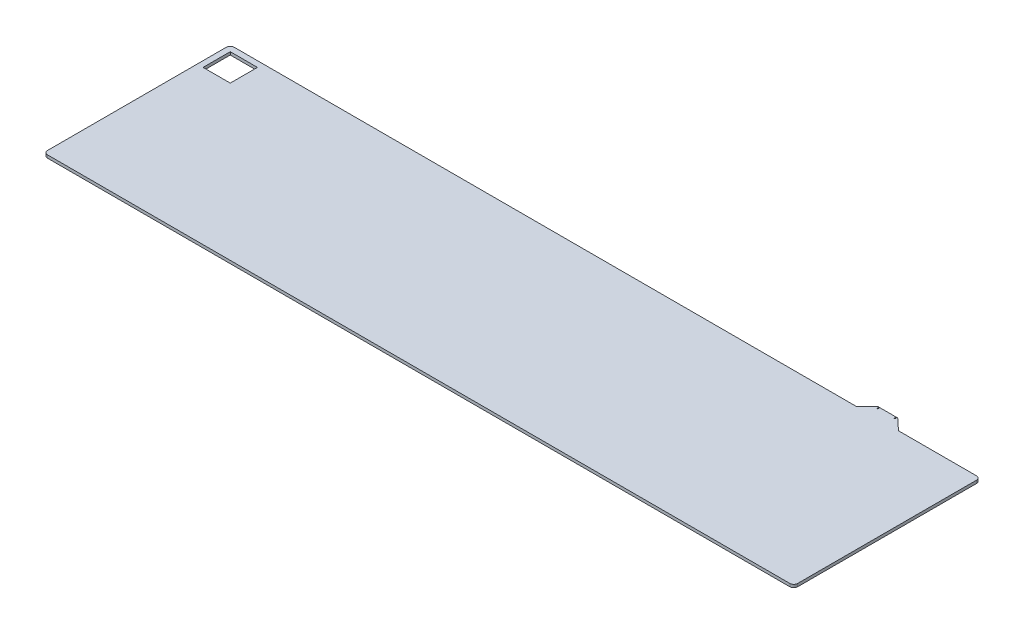
ISO-10303-21;
HEADER;
FILE_DESCRIPTION(('STEP AP214'),'2;1');
FILE_NAME('part.step','',(''),(''),'','','');
FILE_SCHEMA(('AUTOMOTIVE_DESIGN { 1 0 10303 214 1 1 1 1 }'));
ENDSEC;
DATA;
#1=APPLICATION_CONTEXT('core data for automotive mechanical design processes');
#2=APPLICATION_PROTOCOL_DEFINITION('international standard','automotive_design',2000,#1);
#3=PRODUCT_CONTEXT('',#1,'mechanical');
#4=PRODUCT('Part','Part','',(#3));
#5=PRODUCT_RELATED_PRODUCT_CATEGORY('part','',(#4));
#6=PRODUCT_DEFINITION_FORMATION('','',#4);
#7=PRODUCT_DEFINITION_CONTEXT('part definition',#1,'design');
#8=PRODUCT_DEFINITION('design','',#6,#7);
#9=PRODUCT_DEFINITION_SHAPE('','',#8);
#10=(LENGTH_UNIT() NAMED_UNIT(*) SI_UNIT(.MILLI.,.METRE.));
#11=(NAMED_UNIT(*) PLANE_ANGLE_UNIT() SI_UNIT($,.RADIAN.));
#12=(NAMED_UNIT(*) SI_UNIT($,.STERADIAN.) SOLID_ANGLE_UNIT());
#13=UNCERTAINTY_MEASURE_WITH_UNIT(LENGTH_MEASURE(1.E-05),#10,'distance_accuracy_value','');
#14=(GEOMETRIC_REPRESENTATION_CONTEXT(3) GLOBAL_UNCERTAINTY_ASSIGNED_CONTEXT((#13)) GLOBAL_UNIT_ASSIGNED_CONTEXT((#10,
#11,#12)) REPRESENTATION_CONTEXT('',''));
#15=CARTESIAN_POINT('',(0.,0.,0.));
#16=DIRECTION('',(0.,0.,1.));
#17=DIRECTION('',(1.,0.,0.));
#18=AXIS2_PLACEMENT_3D('',#15,#16,#17);
#19=CARTESIAN_POINT('',(384.,0.,-2.));
#20=DIRECTION('',(0.,1.,0.));
#21=DIRECTION('',(0.,0.,1.));
#22=AXIS2_PLACEMENT_3D('',#19,#20,#21);
#23=PLANE('',#22);
#24=CARTESIAN_POINT('',(384.,0.,-2.));
#25=DIRECTION('',(0.,1.,0.));
#26=DIRECTION('',(0.,0.,1.));
#27=AXIS2_PLACEMENT_3D('',#24,#25,#26);
#28=CIRCLE('',#27,2.);
#29=CARTESIAN_POINT('',(384.,0.,0.));
#30=VERTEX_POINT('',#29);
#31=CARTESIAN_POINT('',(386.,0.,-2.00000000000001));
#32=VERTEX_POINT('',#31);
#33=EDGE_CURVE('E384',#30,#32,#28,.T.);
#34=ORIENTED_EDGE('',*,*,#33,.F.);
#35=DIRECTION('',(1.,0.,0.));
#36=VECTOR('',#35,1.);
#37=CARTESIAN_POINT('',(2.00000000000001,0.,0.));
#38=LINE('',#37,#36);
#39=CARTESIAN_POINT('',(2.00000000000001,0.,0.));
#40=VERTEX_POINT('',#39);
#41=EDGE_CURVE('E394',#40,#30,#38,.T.);
#42=ORIENTED_EDGE('',*,*,#41,.F.);
#43=CARTESIAN_POINT('',(2.,0.,-2.));
#44=DIRECTION('',(0.,1.,0.));
#45=DIRECTION('',(0.,0.,-1.));
#46=AXIS2_PLACEMENT_3D('',#43,#44,#45);
#47=CIRCLE('',#46,2.);
#48=CARTESIAN_POINT('',(0.,0.,-2.00000000000001));
#49=VERTEX_POINT('',#48);
#50=EDGE_CURVE('E424',#49,#40,#47,.T.);
#51=ORIENTED_EDGE('',*,*,#50,.F.);
#52=DIRECTION('',(0.,0.,1.));
#53=VECTOR('',#52,1.);
#54=CARTESIAN_POINT('',(0.,0.,-2.00000000000001));
#55=LINE('',#54,#53);
#56=CARTESIAN_POINT('',(0.,0.,-94.));
#57=VERTEX_POINT('',#56);
#58=EDGE_CURVE('E422',#57,#49,#55,.T.);
#59=ORIENTED_EDGE('',*,*,#58,.F.);
#60=CARTESIAN_POINT('',(2.,0.,-94.));
#61=DIRECTION('',(0.,1.,0.));
#62=DIRECTION('',(0.,0.,-1.));
#63=AXIS2_PLACEMENT_3D('',#60,#61,#62);
#64=CIRCLE('',#63,2.);
#65=CARTESIAN_POINT('',(2.,0.,-96.));
#66=VERTEX_POINT('',#65);
#67=EDGE_CURVE('E420',#66,#57,#64,.T.);
#68=ORIENTED_EDGE('',*,*,#67,.F.);
#69=DIRECTION('',(-1.,0.,0.));
#70=VECTOR('',#69,1.);
#71=CARTESIAN_POINT('',(2.00000000000001,0.,-96.));
#72=LINE('',#71,#70);
#73=CARTESIAN_POINT('',(322.1072,0.,-96.));
#74=VERTEX_POINT('',#73);
#75=EDGE_CURVE('E417',#74,#66,#72,.T.);
#76=ORIENTED_EDGE('',*,*,#75,.F.);
#77=DIRECTION('',(-0.731051967865493,0.,0.682321786461484));
#78=VECTOR('',#77,1.);
#79=CARTESIAN_POINT('',(328.,0.,-101.5));
#80=LINE('',#79,#78);
#81=CARTESIAN_POINT('',(328.,0.,-101.5));
#82=VERTEX_POINT('',#81);
#83=EDGE_CURVE('E370',#82,#74,#80,.T.);
#84=ORIENTED_EDGE('',*,*,#83,.F.);
#85=DIRECTION('',(-1.,0.,0.));
#86=VECTOR('',#85,1.);
#87=CARTESIAN_POINT('',(338.,0.,-101.5));
#88=LINE('',#87,#86);
#89=CARTESIAN_POINT('',(338.,0.,-101.5));
#90=VERTEX_POINT('',#89);
#91=EDGE_CURVE('E366',#90,#82,#88,.T.);
#92=ORIENTED_EDGE('',*,*,#91,.F.);
#93=DIRECTION('',(-0.731051967865493,0.,-0.682321786461484));
#94=VECTOR('',#93,1.);
#95=CARTESIAN_POINT('',(343.8928,0.,-96.));
#96=LINE('',#95,#94);
#97=CARTESIAN_POINT('',(343.8928,0.,-96.));
#98=VERTEX_POINT('',#97);
#99=EDGE_CURVE('E363',#98,#90,#96,.T.);
#100=ORIENTED_EDGE('',*,*,#99,.F.);
#101=CARTESIAN_POINT('',(384.,0.,-96.));
#102=VERTEX_POINT('',#101);
#103=EDGE_CURVE('E418',#102,#98,#72,.T.);
#104=ORIENTED_EDGE('',*,*,#103,.F.);
#105=CARTESIAN_POINT('',(384.,0.,-94.));
#106=DIRECTION('',(0.,1.,0.));
#107=DIRECTION('',(0.,0.,-1.));
#108=AXIS2_PLACEMENT_3D('',#105,#106,#107);
#109=CIRCLE('',#108,2.);
#110=CARTESIAN_POINT('',(386.,0.,-94.));
#111=VERTEX_POINT('',#110);
#112=EDGE_CURVE('E415',#111,#102,#109,.T.);
#113=ORIENTED_EDGE('',*,*,#112,.F.);
#114=DIRECTION('',(0.,0.,-1.));
#115=VECTOR('',#114,1.);
#116=CARTESIAN_POINT('',(386.,0.,-2.00000000000001));
#117=LINE('',#116,#115);
#118=EDGE_CURVE('E413',#32,#111,#117,.T.);
#119=ORIENTED_EDGE('',*,*,#118,.F.);
#120=EDGE_LOOP('',(#34,#42,#51,#59,#68,#76,#84,#92,#100,#104,#113,#119));
#121=FACE_BOUND('',#120,.T.);
#122=DIRECTION('',(1.,0.,0.));
#123=VECTOR('',#122,1.);
#124=CARTESIAN_POINT('',(337.68,0.,-100.45));
#125=LINE('',#124,#123);
#126=CARTESIAN_POINT('',(337.18,0.,-100.45));
#127=VERTEX_POINT('',#126);
#128=CARTESIAN_POINT('',(337.68,0.,-100.45));
#129=VERTEX_POINT('',#128);
#130=EDGE_CURVE('E343',#127,#129,#125,.T.);
#131=ORIENTED_EDGE('',*,*,#130,.T.);
#132=DIRECTION('',(0.,0.,-1.));
#133=VECTOR('',#132,1.);
#134=CARTESIAN_POINT('',(337.68,0.,-101.25));
#135=LINE('',#134,#133);
#136=CARTESIAN_POINT('',(337.68,0.,-101.25));
#137=VERTEX_POINT('',#136);
#138=EDGE_CURVE('E333',#129,#137,#135,.T.);
#139=ORIENTED_EDGE('',*,*,#138,.T.);
#140=DIRECTION('',(-1.,0.,0.));
#141=VECTOR('',#140,1.);
#142=CARTESIAN_POINT('',(337.68,0.,-101.25));
#143=LINE('',#142,#141);
#144=CARTESIAN_POINT('',(337.18,0.,-101.25));
#145=VERTEX_POINT('',#144);
#146=EDGE_CURVE('E336',#137,#145,#143,.T.);
#147=ORIENTED_EDGE('',*,*,#146,.T.);
#148=DIRECTION('',(0.,0.,1.));
#149=VECTOR('',#148,1.);
#150=CARTESIAN_POINT('',(337.18,0.,-101.25));
#151=LINE('',#150,#149);
#152=EDGE_CURVE('E340',#145,#127,#151,.T.);
#153=ORIENTED_EDGE('',*,*,#152,.T.);
#154=EDGE_LOOP('',(#131,#139,#147,#153));
#155=FACE_BOUND('',#154,.T.);
#156=DIRECTION('',(-1.,0.,0.));
#157=VECTOR('',#156,1.);
#158=CARTESIAN_POINT('',(328.32,0.,-101.25));
#159=LINE('',#158,#157);
#160=CARTESIAN_POINT('',(328.82,0.,-101.25));
#161=VERTEX_POINT('',#160);
#162=CARTESIAN_POINT('',(328.32,0.,-101.25));
#163=VERTEX_POINT('',#162);
#164=EDGE_CURVE('E309',#161,#163,#159,.T.);
#165=ORIENTED_EDGE('',*,*,#164,.T.);
#166=DIRECTION('',(0.,0.,1.));
#167=VECTOR('',#166,1.);
#168=CARTESIAN_POINT('',(328.32,0.,-101.25));
#169=LINE('',#168,#167);
#170=CARTESIAN_POINT('',(328.32,0.,-100.45));
#171=VERTEX_POINT('',#170);
#172=EDGE_CURVE('E299',#163,#171,#169,.T.);
#173=ORIENTED_EDGE('',*,*,#172,.T.);
#174=DIRECTION('',(1.,0.,0.));
#175=VECTOR('',#174,1.);
#176=CARTESIAN_POINT('',(328.32,0.,-100.45));
#177=LINE('',#176,#175);
#178=CARTESIAN_POINT('',(328.82,0.,-100.45));
#179=VERTEX_POINT('',#178);
#180=EDGE_CURVE('E302',#171,#179,#177,.T.);
#181=ORIENTED_EDGE('',*,*,#180,.T.);
#182=DIRECTION('',(0.,0.,-1.));
#183=VECTOR('',#182,1.);
#184=CARTESIAN_POINT('',(328.82,0.,-101.25));
#185=LINE('',#184,#183);
#186=EDGE_CURVE('E306',#179,#161,#185,.T.);
#187=ORIENTED_EDGE('',*,*,#186,.T.);
#188=EDGE_LOOP('',(#165,#173,#181,#187));
#189=FACE_BOUND('',#188,.T.);
#190=DIRECTION('',(1.,0.,0.));
#191=VECTOR('',#190,1.);
#192=CARTESIAN_POINT('',(375.535127194929,0.,-86.0348725007043));
#193=LINE('',#192,#191);
#194=CARTESIAN_POINT('',(17.,0.,-86.0348725007043));
#195=VERTEX_POINT('',#194);
#196=CARTESIAN_POINT('',(375.535127194929,0.,-86.0348725007043));
#197=VERTEX_POINT('',#196);
#198=EDGE_CURVE('E273',#195,#197,#193,.T.);
#199=ORIENTED_EDGE('',*,*,#198,.F.);
#200=DIRECTION('',(0.,0.,-1.));
#201=VECTOR('',#200,1.);
#202=CARTESIAN_POINT('',(17.,0.,-1.99999999999991));
#203=LINE('',#202,#201);
#204=CARTESIAN_POINT('',(17.,0.,-93.));
#205=VERTEX_POINT('',#204);
#206=EDGE_CURVE('E259',#195,#205,#203,.T.);
#207=ORIENTED_EDGE('',*,*,#206,.T.);
#208=DIRECTION('',(-1.,0.,0.));
#209=VECTOR('',#208,1.);
#210=CARTESIAN_POINT('',(384.,0.,-93.));
#211=LINE('',#210,#209);
#212=CARTESIAN_POINT('',(3.,0.,-93.));
#213=VERTEX_POINT('',#212);
#214=EDGE_CURVE('E262',#205,#213,#211,.T.);
#215=ORIENTED_EDGE('',*,*,#214,.T.);
#216=DIRECTION('',(0.,0.,1.));
#217=VECTOR('',#216,1.);
#218=CARTESIAN_POINT('',(3.,0.,-1.99999999999995));
#219=LINE('',#218,#217);
#220=CARTESIAN_POINT('',(3.,0.,-79.));
#221=VERTEX_POINT('',#220);
#222=EDGE_CURVE('E265',#213,#221,#219,.T.);
#223=ORIENTED_EDGE('',*,*,#222,.T.);
#224=DIRECTION('',(1.,0.,0.));
#225=VECTOR('',#224,1.);
#226=CARTESIAN_POINT('',(384.,0.,-79.));
#227=LINE('',#226,#225);
#228=CARTESIAN_POINT('',(10.2448641881168,0.,-79.));
#229=VERTEX_POINT('',#228);
#230=EDGE_CURVE('E253',#221,#229,#227,.T.);
#231=ORIENTED_EDGE('',*,*,#230,.T.);
#232=DIRECTION('',(0.,0.,-1.));
#233=VECTOR('',#232,1.);
#234=CARTESIAN_POINT('',(10.2448641881168,0.,-6.40835272497497));
#235=LINE('',#234,#233);
#236=CARTESIAN_POINT('',(10.2448641881168,0.,-6.40835272497497));
#237=VERTEX_POINT('',#236);
#238=EDGE_CURVE('E286',#237,#229,#235,.T.);
#239=ORIENTED_EDGE('',*,*,#238,.F.);
#240=DIRECTION('',(-1.,0.,0.));
#241=VECTOR('',#240,1.);
#242=CARTESIAN_POINT('',(375.535127194929,0.,-6.40835272497497));
#243=LINE('',#242,#241);
#244=CARTESIAN_POINT('',(375.535127194929,0.,-6.40835272497497));
#245=VERTEX_POINT('',#244);
#246=EDGE_CURVE('E283',#245,#237,#243,.T.);
#247=ORIENTED_EDGE('',*,*,#246,.F.);
#248=DIRECTION('',(0.,0.,1.));
#249=VECTOR('',#248,1.);
#250=CARTESIAN_POINT('',(375.535127194929,0.,-6.40835272497497));
#251=LINE('',#250,#249);
#252=EDGE_CURVE('E268',#197,#245,#251,.T.);
#253=ORIENTED_EDGE('',*,*,#252,.F.);
#254=EDGE_LOOP('',(#199,#207,#215,#223,#231,#239,#247,#253));
#255=FACE_BOUND('',#254,.T.);
#256=ADVANCED_FACE('F32',(#121,#155,#189,#255),#23,.F.);
#257=CARTESIAN_POINT('',(2.00000000000001,1.5,-96.));
#258=DIRECTION('',(0.,0.,1.));
#259=DIRECTION('',(1.,0.,0.));
#260=AXIS2_PLACEMENT_3D('',#257,#258,#259);
#261=PLANE('',#260);
#262=DIRECTION('',(-1.,0.,0.));
#263=VECTOR('',#262,1.);
#264=CARTESIAN_POINT('',(2.00000000000001,1.5,-96.));
#265=LINE('',#264,#263);
#266=CARTESIAN_POINT('',(322.1072,1.5,-96.));
#267=VERTEX_POINT('',#266);
#268=CARTESIAN_POINT('',(2.,1.5,-96.));
#269=VERTEX_POINT('',#268);
#270=EDGE_CURVE('E398',#267,#269,#265,.T.);
#271=ORIENTED_EDGE('',*,*,#270,.F.);
#272=DIRECTION('',(0.,1.,0.));
#273=VECTOR('',#272,1.);
#274=CARTESIAN_POINT('',(322.1072,0.,-96.));
#275=LINE('',#274,#273);
#276=EDGE_CURVE('E381',#74,#267,#275,.T.);
#277=ORIENTED_EDGE('',*,*,#276,.F.);
#278=ORIENTED_EDGE('',*,*,#75,.T.);
#279=DIRECTION('',(0.,-1.,0.));
#280=VECTOR('',#279,1.);
#281=CARTESIAN_POINT('',(2.,1.5,-96.));
#282=LINE('',#281,#280);
#283=EDGE_CURVE('E438',#269,#66,#282,.T.);
#284=ORIENTED_EDGE('',*,*,#283,.F.);
#285=EDGE_LOOP('',(#271,#277,#278,#284));
#286=FACE_BOUND('',#285,.T.);
#287=ADVANCED_FACE('F484',(#286),#261,.F.);
#288=CARTESIAN_POINT('',(384.,1.5,-2.));
#289=DIRECTION('',(0.,-1.,0.));
#290=DIRECTION('',(0.,0.,-1.));
#291=AXIS2_PLACEMENT_3D('',#288,#289,#290);
#292=CYLINDRICAL_SURFACE('',#291,2.);
#293=ORIENTED_EDGE('',*,*,#33,.T.);
#294=DIRECTION('',(0.,-1.,0.));
#295=VECTOR('',#294,1.);
#296=CARTESIAN_POINT('',(386.,1.5,-2.00000000000001));
#297=LINE('',#296,#295);
#298=CARTESIAN_POINT('',(386.,1.5,-2.00000000000001));
#299=VERTEX_POINT('',#298);
#300=EDGE_CURVE('E40',#299,#32,#297,.T.);
#301=ORIENTED_EDGE('',*,*,#300,.F.);
#302=CARTESIAN_POINT('',(384.,1.5,-2.));
#303=DIRECTION('',(0.,1.,0.));
#304=DIRECTION('',(0.,0.,1.));
#305=AXIS2_PLACEMENT_3D('',#302,#303,#304);
#306=CIRCLE('',#305,2.);
#307=CARTESIAN_POINT('',(384.,1.5,0.));
#308=VERTEX_POINT('',#307);
#309=EDGE_CURVE('E390',#308,#299,#306,.T.);
#310=ORIENTED_EDGE('',*,*,#309,.F.);
#311=DIRECTION('',(0.,-1.,0.));
#312=VECTOR('',#311,1.);
#313=CARTESIAN_POINT('',(384.,1.5,0.));
#314=LINE('',#313,#312);
#315=EDGE_CURVE('E410',#308,#30,#314,.T.);
#316=ORIENTED_EDGE('',*,*,#315,.T.);
#317=EDGE_LOOP('',(#293,#301,#310,#316));
#318=FACE_BOUND('',#317,.T.);
#319=ADVANCED_FACE('F34',(#318),#292,.T.);
#320=CARTESIAN_POINT('',(386.,1.5,-2.00000000000001));
#321=DIRECTION('',(-1.,0.,0.));
#322=DIRECTION('',(0.,0.,1.));
#323=AXIS2_PLACEMENT_3D('',#320,#321,#322);
#324=PLANE('',#323);
#325=ORIENTED_EDGE('',*,*,#118,.T.);
#326=DIRECTION('',(0.,-1.,0.));
#327=VECTOR('',#326,1.);
#328=CARTESIAN_POINT('',(386.,1.5,-94.));
#329=LINE('',#328,#327);
#330=CARTESIAN_POINT('',(386.,1.5,-94.));
#331=VERTEX_POINT('',#330);
#332=EDGE_CURVE('E444',#331,#111,#329,.T.);
#333=ORIENTED_EDGE('',*,*,#332,.F.);
#334=DIRECTION('',(0.,0.,-1.));
#335=VECTOR('',#334,1.);
#336=CARTESIAN_POINT('',(386.,1.5,-2.00000000000001));
#337=LINE('',#336,#335);
#338=EDGE_CURVE('E393',#299,#331,#337,.T.);
#339=ORIENTED_EDGE('',*,*,#338,.F.);
#340=ORIENTED_EDGE('',*,*,#300,.T.);
#341=EDGE_LOOP('',(#325,#333,#339,#340));
#342=FACE_BOUND('',#341,.T.);
#343=ADVANCED_FACE('F449',(#342),#324,.F.);
#344=CARTESIAN_POINT('',(384.,1.5,-94.));
#345=DIRECTION('',(0.,-1.,0.));
#346=DIRECTION('',(0.,0.,-1.));
#347=AXIS2_PLACEMENT_3D('',#344,#345,#346);
#348=CYLINDRICAL_SURFACE('',#347,2.);
#349=ORIENTED_EDGE('',*,*,#112,.T.);
#350=DIRECTION('',(0.,-1.,0.));
#351=VECTOR('',#350,1.);
#352=CARTESIAN_POINT('',(384.,1.5,-96.));
#353=LINE('',#352,#351);
#354=CARTESIAN_POINT('',(384.,1.5,-96.));
#355=VERTEX_POINT('',#354);
#356=EDGE_CURVE('E441',#355,#102,#353,.T.);
#357=ORIENTED_EDGE('',*,*,#356,.F.);
#358=CARTESIAN_POINT('',(384.,1.5,-94.));
#359=DIRECTION('',(0.,1.,0.));
#360=DIRECTION('',(0.,0.,-1.));
#361=AXIS2_PLACEMENT_3D('',#358,#359,#360);
#362=CIRCLE('',#361,2.);
#363=EDGE_CURVE('E396',#331,#355,#362,.T.);
#364=ORIENTED_EDGE('',*,*,#363,.F.);
#365=ORIENTED_EDGE('',*,*,#332,.T.);
#366=EDGE_LOOP('',(#349,#357,#364,#365));
#367=FACE_BOUND('',#366,.T.);
#368=ADVANCED_FACE('F464',(#367),#348,.T.);
#369=ORIENTED_EDGE('',*,*,#103,.T.);
#370=DIRECTION('',(0.,1.,0.));
#371=VECTOR('',#370,1.);
#372=CARTESIAN_POINT('',(343.8928,0.,-96.));
#373=LINE('',#372,#371);
#374=CARTESIAN_POINT('',(343.8928,1.5,-96.));
#375=VERTEX_POINT('',#374);
#376=EDGE_CURVE('E373',#98,#375,#373,.T.);
#377=ORIENTED_EDGE('',*,*,#376,.T.);
#378=EDGE_CURVE('E399',#355,#375,#265,.T.);
#379=ORIENTED_EDGE('',*,*,#378,.F.);
#380=ORIENTED_EDGE('',*,*,#356,.T.);
#381=EDGE_LOOP('',(#369,#377,#379,#380));
#382=FACE_BOUND('',#381,.T.);
#383=ADVANCED_FACE('F468',(#382),#261,.F.);
#384=CARTESIAN_POINT('',(2.,1.5,-94.));
#385=DIRECTION('',(0.,-1.,0.));
#386=DIRECTION('',(0.,0.,-1.));
#387=AXIS2_PLACEMENT_3D('',#384,#385,#386);
#388=CYLINDRICAL_SURFACE('',#387,2.);
#389=ORIENTED_EDGE('',*,*,#67,.T.);
#390=DIRECTION('',(0.,-1.,0.));
#391=VECTOR('',#390,1.);
#392=CARTESIAN_POINT('',(0.,1.5,-94.));
#393=LINE('',#392,#391);
#394=CARTESIAN_POINT('',(0.,1.5,-94.));
#395=VERTEX_POINT('',#394);
#396=EDGE_CURVE('E435',#395,#57,#393,.T.);
#397=ORIENTED_EDGE('',*,*,#396,.F.);
#398=CARTESIAN_POINT('',(2.,1.5,-94.));
#399=DIRECTION('',(0.,1.,0.));
#400=DIRECTION('',(0.,0.,-1.));
#401=AXIS2_PLACEMENT_3D('',#398,#399,#400);
#402=CIRCLE('',#401,2.);
#403=EDGE_CURVE('E402',#269,#395,#402,.T.);
#404=ORIENTED_EDGE('',*,*,#403,.F.);
#405=ORIENTED_EDGE('',*,*,#283,.T.);
#406=EDGE_LOOP('',(#389,#397,#404,#405));
#407=FACE_BOUND('',#406,.T.);
#408=ADVANCED_FACE('F491',(#407),#388,.T.);
#409=CARTESIAN_POINT('',(0.,1.5,-2.00000000000001));
#410=DIRECTION('',(1.,0.,0.));
#411=DIRECTION('',(0.,0.,-1.));
#412=AXIS2_PLACEMENT_3D('',#409,#410,#411);
#413=PLANE('',#412);
#414=ORIENTED_EDGE('',*,*,#58,.T.);
#415=DIRECTION('',(0.,-1.,0.));
#416=VECTOR('',#415,1.);
#417=CARTESIAN_POINT('',(0.,1.5,-2.00000000000001));
#418=LINE('',#417,#416);
#419=CARTESIAN_POINT('',(0.,1.5,-2.00000000000001));
#420=VERTEX_POINT('',#419);
#421=EDGE_CURVE('E432',#420,#49,#418,.T.);
#422=ORIENTED_EDGE('',*,*,#421,.F.);
#423=DIRECTION('',(0.,0.,1.));
#424=VECTOR('',#423,1.);
#425=CARTESIAN_POINT('',(0.,1.5,-2.00000000000001));
#426=LINE('',#425,#424);
#427=EDGE_CURVE('E404',#395,#420,#426,.T.);
#428=ORIENTED_EDGE('',*,*,#427,.F.);
#429=ORIENTED_EDGE('',*,*,#396,.T.);
#430=EDGE_LOOP('',(#414,#422,#428,#429));
#431=FACE_BOUND('',#430,.T.);
#432=ADVANCED_FACE('F495',(#431),#413,.F.);
#433=CARTESIAN_POINT('',(2.,1.5,-2.));
#434=DIRECTION('',(0.,-1.,0.));
#435=DIRECTION('',(0.,0.,-1.));
#436=AXIS2_PLACEMENT_3D('',#433,#434,#435);
#437=CYLINDRICAL_SURFACE('',#436,2.);
#438=ORIENTED_EDGE('',*,*,#50,.T.);
#439=DIRECTION('',(0.,-1.,0.));
#440=VECTOR('',#439,1.);
#441=CARTESIAN_POINT('',(2.00000000000001,1.5,0.));
#442=LINE('',#441,#440);
#443=CARTESIAN_POINT('',(2.00000000000001,1.5,0.));
#444=VERTEX_POINT('',#443);
#445=EDGE_CURVE('E429',#444,#40,#442,.T.);
#446=ORIENTED_EDGE('',*,*,#445,.F.);
#447=CARTESIAN_POINT('',(2.,1.5,-2.));
#448=DIRECTION('',(0.,1.,0.));
#449=DIRECTION('',(0.,0.,-1.));
#450=AXIS2_PLACEMENT_3D('',#447,#448,#449);
#451=CIRCLE('',#450,2.);
#452=EDGE_CURVE('E406',#420,#444,#451,.T.);
#453=ORIENTED_EDGE('',*,*,#452,.F.);
#454=ORIENTED_EDGE('',*,*,#421,.T.);
#455=EDGE_LOOP('',(#438,#446,#453,#454));
#456=FACE_BOUND('',#455,.T.);
#457=ADVANCED_FACE('F499',(#456),#437,.T.);
#458=CARTESIAN_POINT('',(2.00000000000001,1.5,0.));
#459=DIRECTION('',(0.,0.,-1.));
#460=DIRECTION('',(-1.,0.,0.));
#461=AXIS2_PLACEMENT_3D('',#458,#459,#460);
#462=PLANE('',#461);
#463=ORIENTED_EDGE('',*,*,#41,.T.);
#464=ORIENTED_EDGE('',*,*,#315,.F.);
#465=DIRECTION('',(1.,0.,0.));
#466=VECTOR('',#465,1.);
#467=CARTESIAN_POINT('',(2.00000000000001,1.5,0.));
#468=LINE('',#467,#466);
#469=EDGE_CURVE('E408',#444,#308,#468,.T.);
#470=ORIENTED_EDGE('',*,*,#469,.F.);
#471=ORIENTED_EDGE('',*,*,#445,.T.);
#472=EDGE_LOOP('',(#463,#464,#470,#471));
#473=FACE_BOUND('',#472,.T.);
#474=ADVANCED_FACE('F502',(#473),#462,.F.);
#475=CARTESIAN_POINT('',(384.,1.5,-2.));
#476=DIRECTION('',(0.,1.,0.));
#477=DIRECTION('',(0.,0.,1.));
#478=AXIS2_PLACEMENT_3D('',#475,#476,#477);
#479=PLANE('',#478);
#480=DIRECTION('',(0.,0.,1.));
#481=VECTOR('',#480,1.);
#482=CARTESIAN_POINT('',(3.,1.5,-93.));
#483=LINE('',#482,#481);
#484=CARTESIAN_POINT('',(3.,1.5,-93.));
#485=VERTEX_POINT('',#484);
#486=CARTESIAN_POINT('',(3.,1.5,-79.));
#487=VERTEX_POINT('',#486);
#488=EDGE_CURVE('E47',#485,#487,#483,.T.);
#489=ORIENTED_EDGE('',*,*,#488,.F.);
#490=DIRECTION('',(-1.,0.,0.));
#491=VECTOR('',#490,1.);
#492=CARTESIAN_POINT('',(3.,1.5,-93.));
#493=LINE('',#492,#491);
#494=CARTESIAN_POINT('',(17.,1.5,-93.));
#495=VERTEX_POINT('',#494);
#496=EDGE_CURVE('E241',#495,#485,#493,.T.);
#497=ORIENTED_EDGE('',*,*,#496,.F.);
#498=DIRECTION('',(0.,0.,-1.));
#499=VECTOR('',#498,1.);
#500=CARTESIAN_POINT('',(17.,1.5,-93.));
#501=LINE('',#500,#499);
#502=CARTESIAN_POINT('',(17.,1.5,-79.));
#503=VERTEX_POINT('',#502);
#504=EDGE_CURVE('E227',#503,#495,#501,.T.);
#505=ORIENTED_EDGE('',*,*,#504,.F.);
#506=DIRECTION('',(1.,0.,0.));
#507=VECTOR('',#506,1.);
#508=CARTESIAN_POINT('',(3.,1.5,-79.));
#509=LINE('',#508,#507);
#510=EDGE_CURVE('E234',#487,#503,#509,.T.);
#511=ORIENTED_EDGE('',*,*,#510,.F.);
#512=EDGE_LOOP('',(#489,#497,#505,#511));
#513=FACE_BOUND('',#512,.T.);
#514=DIRECTION('',(0.,0.,1.));
#515=VECTOR('',#514,1.);
#516=CARTESIAN_POINT('',(328.32,1.5,-101.25));
#517=LINE('',#516,#515);
#518=CARTESIAN_POINT('',(328.32,1.5,-101.25));
#519=VERTEX_POINT('',#518);
#520=CARTESIAN_POINT('',(328.32,1.5,-100.45));
#521=VERTEX_POINT('',#520);
#522=EDGE_CURVE('E313',#519,#521,#517,.T.);
#523=ORIENTED_EDGE('',*,*,#522,.F.);
#524=DIRECTION('',(-1.,0.,0.));
#525=VECTOR('',#524,1.);
#526=CARTESIAN_POINT('',(328.32,1.5,-101.25));
#527=LINE('',#526,#525);
#528=CARTESIAN_POINT('',(328.82,1.5,-101.25));
#529=VERTEX_POINT('',#528);
#530=EDGE_CURVE('E303',#529,#519,#527,.T.);
#531=ORIENTED_EDGE('',*,*,#530,.F.);
#532=DIRECTION('',(0.,0.,-1.));
#533=VECTOR('',#532,1.);
#534=CARTESIAN_POINT('',(328.82,1.5,-101.25));
#535=LINE('',#534,#533);
#536=CARTESIAN_POINT('',(328.82,1.5,-100.45));
#537=VERTEX_POINT('',#536);
#538=EDGE_CURVE('E319',#537,#529,#535,.T.);
#539=ORIENTED_EDGE('',*,*,#538,.F.);
#540=DIRECTION('',(1.,0.,0.));
#541=VECTOR('',#540,1.);
#542=CARTESIAN_POINT('',(328.32,1.5,-100.45));
#543=LINE('',#542,#541);
#544=EDGE_CURVE('E315',#521,#537,#543,.T.);
#545=ORIENTED_EDGE('',*,*,#544,.F.);
#546=EDGE_LOOP('',(#523,#531,#539,#545));
#547=FACE_BOUND('',#546,.T.);
#548=DIRECTION('',(0.,0.,-1.));
#549=VECTOR('',#548,1.);
#550=CARTESIAN_POINT('',(337.68,1.5,-101.25));
#551=LINE('',#550,#549);
#552=CARTESIAN_POINT('',(337.68,1.5,-100.45));
#553=VERTEX_POINT('',#552);
#554=CARTESIAN_POINT('',(337.68,1.5,-101.25));
#555=VERTEX_POINT('',#554);
#556=EDGE_CURVE('E298',#553,#555,#551,.T.);
#557=ORIENTED_EDGE('',*,*,#556,.F.);
#558=DIRECTION('',(1.,0.,0.));
#559=VECTOR('',#558,1.);
#560=CARTESIAN_POINT('',(337.68,1.5,-100.45));
#561=LINE('',#560,#559);
#562=CARTESIAN_POINT('',(337.18,1.5,-100.45));
#563=VERTEX_POINT('',#562);
#564=EDGE_CURVE('E337',#563,#553,#561,.T.);
#565=ORIENTED_EDGE('',*,*,#564,.F.);
#566=DIRECTION('',(0.,0.,1.));
#567=VECTOR('',#566,1.);
#568=CARTESIAN_POINT('',(337.18,1.5,-101.25));
#569=LINE('',#568,#567);
#570=CARTESIAN_POINT('',(337.18,1.5,-101.25));
#571=VERTEX_POINT('',#570);
#572=EDGE_CURVE('E351',#571,#563,#569,.T.);
#573=ORIENTED_EDGE('',*,*,#572,.F.);
#574=DIRECTION('',(-1.,0.,0.));
#575=VECTOR('',#574,1.);
#576=CARTESIAN_POINT('',(337.68,1.5,-101.25));
#577=LINE('',#576,#575);
#578=EDGE_CURVE('E348',#555,#571,#577,.T.);
#579=ORIENTED_EDGE('',*,*,#578,.F.);
#580=EDGE_LOOP('',(#557,#565,#573,#579));
#581=FACE_BOUND('',#580,.T.);
#582=ORIENTED_EDGE('',*,*,#309,.T.);
#583=ORIENTED_EDGE('',*,*,#338,.T.);
#584=ORIENTED_EDGE('',*,*,#363,.T.);
#585=ORIENTED_EDGE('',*,*,#378,.T.);
#586=DIRECTION('',(-0.731051967865493,0.,-0.682321786461484));
#587=VECTOR('',#586,1.);
#588=CARTESIAN_POINT('',(343.8928,1.5,-96.));
#589=LINE('',#588,#587);
#590=CARTESIAN_POINT('',(338.,1.5,-101.5));
#591=VERTEX_POINT('',#590);
#592=EDGE_CURVE('E326',#375,#591,#589,.T.);
#593=ORIENTED_EDGE('',*,*,#592,.T.);
#594=DIRECTION('',(-1.,0.,0.));
#595=VECTOR('',#594,1.);
#596=CARTESIAN_POINT('',(338.,1.5,-101.5));
#597=LINE('',#596,#595);
#598=CARTESIAN_POINT('',(328.,1.5,-101.5));
#599=VERTEX_POINT('',#598);
#600=EDGE_CURVE('E376',#591,#599,#597,.T.);
#601=ORIENTED_EDGE('',*,*,#600,.T.);
#602=DIRECTION('',(-0.731051967865493,0.,0.682321786461484));
#603=VECTOR('',#602,1.);
#604=CARTESIAN_POINT('',(328.,1.5,-101.5));
#605=LINE('',#604,#603);
#606=EDGE_CURVE('E367',#599,#267,#605,.T.);
#607=ORIENTED_EDGE('',*,*,#606,.T.);
#608=ORIENTED_EDGE('',*,*,#270,.T.);
#609=ORIENTED_EDGE('',*,*,#403,.T.);
#610=ORIENTED_EDGE('',*,*,#427,.T.);
#611=ORIENTED_EDGE('',*,*,#452,.T.);
#612=ORIENTED_EDGE('',*,*,#469,.T.);
#613=EDGE_LOOP('',(#582,#583,#584,#585,#593,#601,#607,#608,#609,#610,#611,#612));
#614=FACE_BOUND('',#613,.T.);
#615=ADVANCED_FACE('F238',(#513,#547,#581,#614),#479,.T.);
#616=CARTESIAN_POINT('',(328.,0.,-101.5));
#617=DIRECTION('',(-0.682321786461484,0.,-0.731051967865493));
#618=DIRECTION('',(-0.731051967865493,0.,0.682321786461484));
#619=AXIS2_PLACEMENT_3D('',#616,#617,#618);
#620=PLANE('',#619);
#621=ORIENTED_EDGE('',*,*,#606,.F.);
#622=DIRECTION('',(0.,1.,0.));
#623=VECTOR('',#622,1.);
#624=CARTESIAN_POINT('',(328.,0.,-101.5));
#625=LINE('',#624,#623);
#626=EDGE_CURVE('E385',#82,#599,#625,.T.);
#627=ORIENTED_EDGE('',*,*,#626,.F.);
#628=ORIENTED_EDGE('',*,*,#83,.T.);
#629=ORIENTED_EDGE('',*,*,#276,.T.);
#630=EDGE_LOOP('',(#621,#627,#628,#629));
#631=FACE_BOUND('',#630,.T.);
#632=ADVANCED_FACE('F480',(#631),#620,.T.);
#633=CARTESIAN_POINT('',(338.,0.,-101.5));
#634=DIRECTION('',(0.,0.,-1.));
#635=DIRECTION('',(-1.,0.,0.));
#636=AXIS2_PLACEMENT_3D('',#633,#634,#635);
#637=PLANE('',#636);
#638=ORIENTED_EDGE('',*,*,#600,.F.);
#639=DIRECTION('',(0.,1.,0.));
#640=VECTOR('',#639,1.);
#641=CARTESIAN_POINT('',(338.,0.,-101.5));
#642=LINE('',#641,#640);
#643=EDGE_CURVE('E387',#90,#591,#642,.T.);
#644=ORIENTED_EDGE('',*,*,#643,.F.);
#645=ORIENTED_EDGE('',*,*,#91,.T.);
#646=ORIENTED_EDGE('',*,*,#626,.T.);
#647=EDGE_LOOP('',(#638,#644,#645,#646));
#648=FACE_BOUND('',#647,.T.);
#649=ADVANCED_FACE('F477',(#648),#637,.T.);
#650=CARTESIAN_POINT('',(343.8928,0.,-96.));
#651=DIRECTION('',(0.682321786461484,0.,-0.731051967865493));
#652=DIRECTION('',(-0.731051967865493,0.,-0.682321786461484));
#653=AXIS2_PLACEMENT_3D('',#650,#651,#652);
#654=PLANE('',#653);
#655=ORIENTED_EDGE('',*,*,#592,.F.);
#656=ORIENTED_EDGE('',*,*,#376,.F.);
#657=ORIENTED_EDGE('',*,*,#99,.T.);
#658=ORIENTED_EDGE('',*,*,#643,.T.);
#659=EDGE_LOOP('',(#655,#656,#657,#658));
#660=FACE_BOUND('',#659,.T.);
#661=ADVANCED_FACE('F473',(#660),#654,.T.);
#662=CARTESIAN_POINT('',(337.68,0.,-101.25));
#663=DIRECTION('',(1.,0.,0.));
#664=DIRECTION('',(0.,0.,-1.));
#665=AXIS2_PLACEMENT_3D('',#662,#663,#664);
#666=PLANE('',#665);
#667=ORIENTED_EDGE('',*,*,#556,.T.);
#668=DIRECTION('',(0.,1.,0.));
#669=VECTOR('',#668,1.);
#670=CARTESIAN_POINT('',(337.68,0.,-101.25));
#671=LINE('',#670,#669);
#672=EDGE_CURVE('E346',#137,#555,#671,.T.);
#673=ORIENTED_EDGE('',*,*,#672,.F.);
#674=ORIENTED_EDGE('',*,*,#138,.F.);
#675=DIRECTION('',(0.,1.,0.));
#676=VECTOR('',#675,1.);
#677=CARTESIAN_POINT('',(337.68,0.,-100.45));
#678=LINE('',#677,#676);
#679=EDGE_CURVE('E316',#129,#553,#678,.T.);
#680=ORIENTED_EDGE('',*,*,#679,.T.);
#681=EDGE_LOOP('',(#667,#673,#674,#680));
#682=FACE_BOUND('',#681,.T.);
#683=ADVANCED_FACE('F520',(#682),#666,.F.);
#684=CARTESIAN_POINT('',(337.68,0.,-100.45));
#685=DIRECTION('',(0.,0.,1.));
#686=DIRECTION('',(1.,0.,0.));
#687=AXIS2_PLACEMENT_3D('',#684,#685,#686);
#688=PLANE('',#687);
#689=ORIENTED_EDGE('',*,*,#564,.T.);
#690=ORIENTED_EDGE('',*,*,#679,.F.);
#691=ORIENTED_EDGE('',*,*,#130,.F.);
#692=DIRECTION('',(0.,1.,0.));
#693=VECTOR('',#692,1.);
#694=CARTESIAN_POINT('',(337.18,0.,-100.45));
#695=LINE('',#694,#693);
#696=EDGE_CURVE('E357',#127,#563,#695,.T.);
#697=ORIENTED_EDGE('',*,*,#696,.T.);
#698=EDGE_LOOP('',(#689,#690,#691,#697));
#699=FACE_BOUND('',#698,.T.);
#700=ADVANCED_FACE('F527',(#699),#688,.F.);
#701=CARTESIAN_POINT('',(337.18,0.,-101.25));
#702=DIRECTION('',(-1.,0.,0.));
#703=DIRECTION('',(0.,0.,1.));
#704=AXIS2_PLACEMENT_3D('',#701,#702,#703);
#705=PLANE('',#704);
#706=ORIENTED_EDGE('',*,*,#572,.T.);
#707=ORIENTED_EDGE('',*,*,#696,.F.);
#708=ORIENTED_EDGE('',*,*,#152,.F.);
#709=DIRECTION('',(0.,1.,0.));
#710=VECTOR('',#709,1.);
#711=CARTESIAN_POINT('',(337.18,0.,-101.25));
#712=LINE('',#711,#710);
#713=EDGE_CURVE('E359',#145,#571,#712,.T.);
#714=ORIENTED_EDGE('',*,*,#713,.T.);
#715=EDGE_LOOP('',(#706,#707,#708,#714));
#716=FACE_BOUND('',#715,.T.);
#717=ADVANCED_FACE('F533',(#716),#705,.F.);
#718=CARTESIAN_POINT('',(337.68,0.,-101.25));
#719=DIRECTION('',(0.,0.,-1.));
#720=DIRECTION('',(-1.,0.,0.));
#721=AXIS2_PLACEMENT_3D('',#718,#719,#720);
#722=PLANE('',#721);
#723=ORIENTED_EDGE('',*,*,#578,.T.);
#724=ORIENTED_EDGE('',*,*,#713,.F.);
#725=ORIENTED_EDGE('',*,*,#146,.F.);
#726=ORIENTED_EDGE('',*,*,#672,.T.);
#727=EDGE_LOOP('',(#723,#724,#725,#726));
#728=FACE_BOUND('',#727,.T.);
#729=ADVANCED_FACE('F529',(#728),#722,.F.);
#730=CARTESIAN_POINT('',(328.32,0.,-101.25));
#731=DIRECTION('',(-1.,0.,0.));
#732=DIRECTION('',(0.,0.,1.));
#733=AXIS2_PLACEMENT_3D('',#730,#731,#732);
#734=PLANE('',#733);
#735=ORIENTED_EDGE('',*,*,#522,.T.);
#736=DIRECTION('',(0.,1.,0.));
#737=VECTOR('',#736,1.);
#738=CARTESIAN_POINT('',(328.32,0.,-100.45));
#739=LINE('',#738,#737);
#740=EDGE_CURVE('E312',#171,#521,#739,.T.);
#741=ORIENTED_EDGE('',*,*,#740,.F.);
#742=ORIENTED_EDGE('',*,*,#172,.F.);
#743=DIRECTION('',(0.,1.,0.));
#744=VECTOR('',#743,1.);
#745=CARTESIAN_POINT('',(328.32,0.,-101.25));
#746=LINE('',#745,#744);
#747=EDGE_CURVE('E324',#163,#519,#746,.T.);
#748=ORIENTED_EDGE('',*,*,#747,.T.);
#749=EDGE_LOOP('',(#735,#741,#742,#748));
#750=FACE_BOUND('',#749,.T.);
#751=ADVANCED_FACE('F532',(#750),#734,.F.);
#752=CARTESIAN_POINT('',(328.32,0.,-101.25));
#753=DIRECTION('',(0.,0.,-1.));
#754=DIRECTION('',(-1.,0.,0.));
#755=AXIS2_PLACEMENT_3D('',#752,#753,#754);
#756=PLANE('',#755);
#757=ORIENTED_EDGE('',*,*,#530,.T.);
#758=ORIENTED_EDGE('',*,*,#747,.F.);
#759=ORIENTED_EDGE('',*,*,#164,.F.);
#760=DIRECTION('',(0.,1.,0.));
#761=VECTOR('',#760,1.);
#762=CARTESIAN_POINT('',(328.82,0.,-101.25));
#763=LINE('',#762,#761);
#764=EDGE_CURVE('E327',#161,#529,#763,.T.);
#765=ORIENTED_EDGE('',*,*,#764,.T.);
#766=EDGE_LOOP('',(#757,#758,#759,#765));
#767=FACE_BOUND('',#766,.T.);
#768=ADVANCED_FACE('F543',(#767),#756,.F.);
#769=CARTESIAN_POINT('',(328.82,0.,-101.25));
#770=DIRECTION('',(1.,0.,0.));
#771=DIRECTION('',(0.,0.,-1.));
#772=AXIS2_PLACEMENT_3D('',#769,#770,#771);
#773=PLANE('',#772);
#774=ORIENTED_EDGE('',*,*,#538,.T.);
#775=ORIENTED_EDGE('',*,*,#764,.F.);
#776=ORIENTED_EDGE('',*,*,#186,.F.);
#777=DIRECTION('',(0.,1.,0.));
#778=VECTOR('',#777,1.);
#779=CARTESIAN_POINT('',(328.82,0.,-100.45));
#780=LINE('',#779,#778);
#781=EDGE_CURVE('E329',#179,#537,#780,.T.);
#782=ORIENTED_EDGE('',*,*,#781,.T.);
#783=EDGE_LOOP('',(#774,#775,#776,#782));
#784=FACE_BOUND('',#783,.T.);
#785=ADVANCED_FACE('F549',(#784),#773,.F.);
#786=CARTESIAN_POINT('',(328.32,0.,-100.45));
#787=DIRECTION('',(0.,0.,1.));
#788=DIRECTION('',(1.,0.,0.));
#789=AXIS2_PLACEMENT_3D('',#786,#787,#788);
#790=PLANE('',#789);
#791=ORIENTED_EDGE('',*,*,#544,.T.);
#792=ORIENTED_EDGE('',*,*,#781,.F.);
#793=ORIENTED_EDGE('',*,*,#180,.F.);
#794=ORIENTED_EDGE('',*,*,#740,.T.);
#795=EDGE_LOOP('',(#791,#792,#793,#794));
#796=FACE_BOUND('',#795,.T.);
#797=ADVANCED_FACE('F545',(#796),#790,.F.);
#798=CARTESIAN_POINT('',(375.535127194929,-1.6,-6.40835272497497));
#799=DIRECTION('',(-1.,0.,0.));
#800=DIRECTION('',(0.,0.,1.));
#801=AXIS2_PLACEMENT_3D('',#798,#799,#800);
#802=PLANE('',#801);
#803=ORIENTED_EDGE('',*,*,#252,.T.);
#804=DIRECTION('',(0.,1.,0.));
#805=VECTOR('',#804,1.);
#806=CARTESIAN_POINT('',(375.535127194929,-1.6,-6.40835272497497));
#807=LINE('',#806,#805);
#808=CARTESIAN_POINT('',(375.535127194929,-1.6,-6.40835272497497));
#809=VERTEX_POINT('',#808);
#810=EDGE_CURVE('E295',#809,#245,#807,.T.);
#811=ORIENTED_EDGE('',*,*,#810,.F.);
#812=DIRECTION('',(0.,0.,1.));
#813=VECTOR('',#812,1.);
#814=CARTESIAN_POINT('',(375.535127194929,-1.6,-6.40835272497497));
#815=LINE('',#814,#813);
#816=CARTESIAN_POINT('',(375.535127194929,-1.6,-86.0348725007043));
#817=VERTEX_POINT('',#816);
#818=EDGE_CURVE('E269',#817,#809,#815,.T.);
#819=ORIENTED_EDGE('',*,*,#818,.F.);
#820=DIRECTION('',(0.,1.,0.));
#821=VECTOR('',#820,1.);
#822=CARTESIAN_POINT('',(375.535127194929,-1.6,-86.0348725007043));
#823=LINE('',#822,#821);
#824=EDGE_CURVE('E280',#817,#197,#823,.T.);
#825=ORIENTED_EDGE('',*,*,#824,.T.);
#826=EDGE_LOOP('',(#803,#811,#819,#825));
#827=FACE_BOUND('',#826,.T.);
#828=ADVANCED_FACE('F548',(#827),#802,.F.);
#829=CARTESIAN_POINT('',(375.535127194929,-1.6,-6.40835272497497));
#830=DIRECTION('',(0.,0.,-1.));
#831=DIRECTION('',(-1.,0.,0.));
#832=AXIS2_PLACEMENT_3D('',#829,#830,#831);
#833=PLANE('',#832);
#834=ORIENTED_EDGE('',*,*,#246,.T.);
#835=DIRECTION('',(0.,1.,0.));
#836=VECTOR('',#835,1.);
#837=CARTESIAN_POINT('',(10.2448641881168,-1.6,-6.40835272497497));
#838=LINE('',#837,#836);
#839=CARTESIAN_POINT('',(10.2448641881168,-1.6,-6.40835272497497));
#840=VERTEX_POINT('',#839);
#841=EDGE_CURVE('E292',#840,#237,#838,.T.);
#842=ORIENTED_EDGE('',*,*,#841,.F.);
#843=DIRECTION('',(-1.,0.,0.));
#844=VECTOR('',#843,1.);
#845=CARTESIAN_POINT('',(375.535127194929,-1.6,-6.40835272497497));
#846=LINE('',#845,#844);
#847=EDGE_CURVE('E272',#809,#840,#846,.T.);
#848=ORIENTED_EDGE('',*,*,#847,.F.);
#849=ORIENTED_EDGE('',*,*,#810,.T.);
#850=EDGE_LOOP('',(#834,#842,#848,#849));
#851=FACE_BOUND('',#850,.T.);
#852=ADVANCED_FACE('F559',(#851),#833,.F.);
#853=CARTESIAN_POINT('',(10.2448641881168,-1.6,-6.40835272497497));
#854=DIRECTION('',(1.,0.,0.));
#855=DIRECTION('',(0.,0.,-1.));
#856=AXIS2_PLACEMENT_3D('',#853,#854,#855);
#857=PLANE('',#856);
#858=ORIENTED_EDGE('',*,*,#238,.T.);
#859=DIRECTION('',(0.,-1.,0.));
#860=VECTOR('',#859,1.);
#861=CARTESIAN_POINT('',(10.2448641881168,-1.6,-79.));
#862=LINE('',#861,#860);
#863=CARTESIAN_POINT('',(10.2448641881168,-1.6,-79.));
#864=VERTEX_POINT('',#863);
#865=EDGE_CURVE('E248',#229,#864,#862,.T.);
#866=ORIENTED_EDGE('',*,*,#865,.T.);
#867=DIRECTION('',(0.,0.,-1.));
#868=VECTOR('',#867,1.);
#869=CARTESIAN_POINT('',(10.2448641881168,-1.6,-6.40835272497497));
#870=LINE('',#869,#868);
#871=EDGE_CURVE('E275',#840,#864,#870,.T.);
#872=ORIENTED_EDGE('',*,*,#871,.F.);
#873=ORIENTED_EDGE('',*,*,#841,.T.);
#874=EDGE_LOOP('',(#858,#866,#872,#873));
#875=FACE_BOUND('',#874,.T.);
#876=ADVANCED_FACE('F563',(#875),#857,.F.);
#877=CARTESIAN_POINT('',(375.535127194929,-1.6,-86.0348725007043));
#878=DIRECTION('',(0.,0.,1.));
#879=DIRECTION('',(1.,0.,0.));
#880=AXIS2_PLACEMENT_3D('',#877,#878,#879);
#881=PLANE('',#880);
#882=DIRECTION('',(1.,0.,0.));
#883=VECTOR('',#882,1.);
#884=CARTESIAN_POINT('',(375.535127194929,-1.6,-86.0348725007043));
#885=LINE('',#884,#883);
#886=CARTESIAN_POINT('',(17.,-1.6,-86.0348725007043));
#887=VERTEX_POINT('',#886);
#888=EDGE_CURVE('E278',#887,#817,#885,.T.);
#889=ORIENTED_EDGE('',*,*,#888,.F.);
#890=DIRECTION('',(0.,1.,0.));
#891=VECTOR('',#890,1.);
#892=CARTESIAN_POINT('',(17.,-1.6,-86.0348725007043));
#893=LINE('',#892,#891);
#894=EDGE_CURVE('E256',#887,#195,#893,.T.);
#895=ORIENTED_EDGE('',*,*,#894,.T.);
#896=ORIENTED_EDGE('',*,*,#198,.T.);
#897=ORIENTED_EDGE('',*,*,#824,.F.);
#898=EDGE_LOOP('',(#889,#895,#896,#897));
#899=FACE_BOUND('',#898,.T.);
#900=ADVANCED_FACE('F567',(#899),#881,.F.);
#901=CARTESIAN_POINT('',(0.,-1.6,0.));
#902=DIRECTION('',(0.,1.,0.));
#903=DIRECTION('',(0.,0.,1.));
#904=AXIS2_PLACEMENT_3D('',#901,#902,#903);
#905=PLANE('',#904);
#906=DIRECTION('',(1.,0.,0.));
#907=VECTOR('',#906,1.);
#908=CARTESIAN_POINT('',(0.,-1.6,-79.));
#909=LINE('',#908,#907);
#910=CARTESIAN_POINT('',(17.,-1.6,-79.));
#911=VERTEX_POINT('',#910);
#912=EDGE_CURVE('E11',#864,#911,#909,.T.);
#913=ORIENTED_EDGE('',*,*,#912,.T.);
#914=DIRECTION('',(0.,0.,-1.));
#915=VECTOR('',#914,1.);
#916=CARTESIAN_POINT('',(17.,-1.6,-93.));
#917=LINE('',#916,#915);
#918=EDGE_CURVE('E55',#911,#887,#917,.T.);
#919=ORIENTED_EDGE('',*,*,#918,.T.);
#920=ORIENTED_EDGE('',*,*,#888,.T.);
#921=ORIENTED_EDGE('',*,*,#818,.T.);
#922=ORIENTED_EDGE('',*,*,#847,.T.);
#923=ORIENTED_EDGE('',*,*,#871,.T.);
#924=EDGE_LOOP('',(#913,#919,#920,#921,#922,#923));
#925=FACE_BOUND('',#924,.T.);
#926=ADVANCED_FACE('F571',(#925),#905,.F.);
#927=CARTESIAN_POINT('',(3.,-1.6,-93.));
#928=DIRECTION('',(-1.,0.,0.));
#929=DIRECTION('',(0.,0.,1.));
#930=AXIS2_PLACEMENT_3D('',#927,#928,#929);
#931=PLANE('',#930);
#932=DIRECTION('',(0.,1.,0.));
#933=VECTOR('',#932,1.);
#934=CARTESIAN_POINT('',(3.,-1.6,-93.));
#935=LINE('',#934,#933);
#936=EDGE_CURVE('E246',#213,#485,#935,.T.);
#937=ORIENTED_EDGE('',*,*,#936,.T.);
#938=ORIENTED_EDGE('',*,*,#488,.T.);
#939=DIRECTION('',(0.,1.,0.));
#940=VECTOR('',#939,1.);
#941=CARTESIAN_POINT('',(3.,-1.6,-79.));
#942=LINE('',#941,#940);
#943=EDGE_CURVE('E231',#221,#487,#942,.T.);
#944=ORIENTED_EDGE('',*,*,#943,.F.);
#945=ORIENTED_EDGE('',*,*,#222,.F.);
#946=EDGE_LOOP('',(#937,#938,#944,#945));
#947=FACE_BOUND('',#946,.T.);
#948=ADVANCED_FACE('F575',(#947),#931,.F.);
#949=CARTESIAN_POINT('',(3.,-1.6,-93.));
#950=DIRECTION('',(0.,0.,-1.));
#951=DIRECTION('',(-1.,0.,0.));
#952=AXIS2_PLACEMENT_3D('',#949,#950,#951);
#953=PLANE('',#952);
#954=DIRECTION('',(0.,1.,0.));
#955=VECTOR('',#954,1.);
#956=CARTESIAN_POINT('',(17.,-1.6,-93.));
#957=LINE('',#956,#955);
#958=EDGE_CURVE('E230',#205,#495,#957,.T.);
#959=ORIENTED_EDGE('',*,*,#958,.T.);
#960=ORIENTED_EDGE('',*,*,#496,.T.);
#961=ORIENTED_EDGE('',*,*,#936,.F.);
#962=ORIENTED_EDGE('',*,*,#214,.F.);
#963=EDGE_LOOP('',(#959,#960,#961,#962));
#964=FACE_BOUND('',#963,.T.);
#965=ADVANCED_FACE('F579',(#964),#953,.F.);
#966=CARTESIAN_POINT('',(17.,-1.6,-93.));
#967=DIRECTION('',(1.,0.,0.));
#968=DIRECTION('',(0.,0.,-1.));
#969=AXIS2_PLACEMENT_3D('',#966,#967,#968);
#970=PLANE('',#969);
#971=ORIENTED_EDGE('',*,*,#894,.F.);
#972=ORIENTED_EDGE('',*,*,#918,.F.);
#973=DIRECTION('',(0.,1.,0.));
#974=VECTOR('',#973,1.);
#975=CARTESIAN_POINT('',(17.,-1.6,-79.));
#976=LINE('',#975,#974);
#977=EDGE_CURVE('E222',#911,#503,#976,.T.);
#978=ORIENTED_EDGE('',*,*,#977,.T.);
#979=ORIENTED_EDGE('',*,*,#504,.T.);
#980=ORIENTED_EDGE('',*,*,#958,.F.);
#981=ORIENTED_EDGE('',*,*,#206,.F.);
#982=EDGE_LOOP('',(#971,#972,#978,#979,#980,#981));
#983=FACE_BOUND('',#982,.T.);
#984=ADVANCED_FACE('F224',(#983),#970,.F.);
#985=CARTESIAN_POINT('',(3.,-1.6,-79.));
#986=DIRECTION('',(0.,0.,1.));
#987=DIRECTION('',(1.,0.,0.));
#988=AXIS2_PLACEMENT_3D('',#985,#986,#987);
#989=PLANE('',#988);
#990=ORIENTED_EDGE('',*,*,#943,.T.);
#991=ORIENTED_EDGE('',*,*,#510,.T.);
#992=ORIENTED_EDGE('',*,*,#977,.F.);
#993=ORIENTED_EDGE('',*,*,#912,.F.);
#994=ORIENTED_EDGE('',*,*,#865,.F.);
#995=ORIENTED_EDGE('',*,*,#230,.F.);
#996=EDGE_LOOP('',(#990,#991,#992,#993,#994,#995));
#997=FACE_BOUND('',#996,.T.);
#998=ADVANCED_FACE('F235',(#997),#989,.F.);
#999=CLOSED_SHELL('',(#256,#287,#319,#343,#368,#383,#408,#432,#457,#474,#615,#632,#649,#661,
#683,#700,#717,#729,#751,#768,#785,#797,#828,#852,#876,#900,#926,#948,#965,#984,#998));
#1000=MANIFOLD_SOLID_BREP('B2',#999);
#1001=ADVANCED_BREP_SHAPE_REPRESENTATION('',(#18,#1000),#14);
#1002=SHAPE_DEFINITION_REPRESENTATION(#9,#1001);
ENDSEC;
END-ISO-10303-21;
